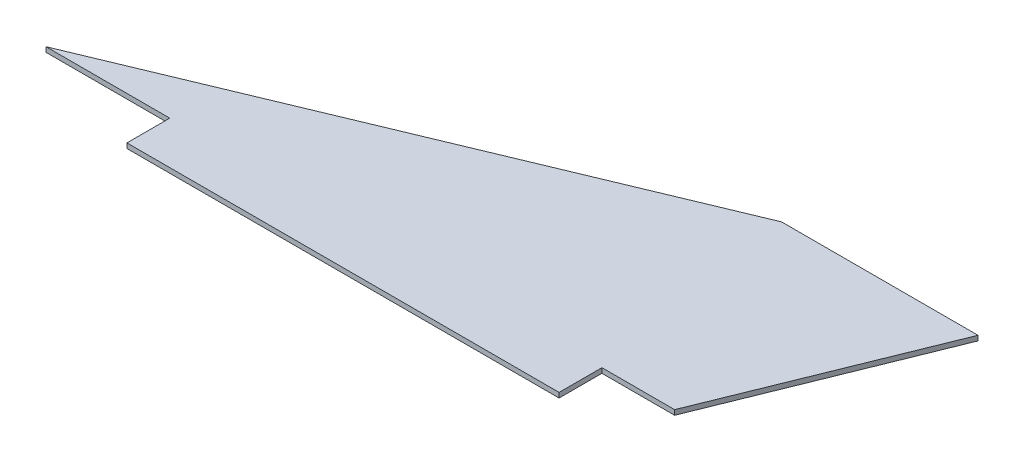
ISO-10303-21;
HEADER;
FILE_DESCRIPTION(('STEP AP214'),'2;1');
FILE_NAME('part.step','',(''),(''),'','','');
FILE_SCHEMA(('AUTOMOTIVE_DESIGN { 1 0 10303 214 1 1 1 1 }'));
ENDSEC;
DATA;
#1=APPLICATION_CONTEXT('core data for automotive mechanical design processes');
#2=APPLICATION_PROTOCOL_DEFINITION('international standard','automotive_design',2000,#1);
#3=PRODUCT_CONTEXT('',#1,'mechanical');
#4=PRODUCT('Part','Part','',(#3));
#5=PRODUCT_RELATED_PRODUCT_CATEGORY('part','',(#4));
#6=PRODUCT_DEFINITION_FORMATION('','',#4);
#7=PRODUCT_DEFINITION_CONTEXT('part definition',#1,'design');
#8=PRODUCT_DEFINITION('design','',#6,#7);
#9=PRODUCT_DEFINITION_SHAPE('','',#8);
#10=(LENGTH_UNIT() NAMED_UNIT(*) SI_UNIT(.MILLI.,.METRE.));
#11=(NAMED_UNIT(*) PLANE_ANGLE_UNIT() SI_UNIT($,.RADIAN.));
#12=(NAMED_UNIT(*) SI_UNIT($,.STERADIAN.) SOLID_ANGLE_UNIT());
#13=UNCERTAINTY_MEASURE_WITH_UNIT(LENGTH_MEASURE(1.E-05),#10,'distance_accuracy_value','');
#14=(GEOMETRIC_REPRESENTATION_CONTEXT(3) GLOBAL_UNCERTAINTY_ASSIGNED_CONTEXT((#13)) GLOBAL_UNIT_ASSIGNED_CONTEXT((#10,
#11,#12)) REPRESENTATION_CONTEXT('',''));
#15=CARTESIAN_POINT('',(0.,0.,0.));
#16=DIRECTION('',(0.,0.,1.));
#17=DIRECTION('',(1.,0.,0.));
#18=AXIS2_PLACEMENT_3D('',#15,#16,#17);
#19=CARTESIAN_POINT('',(335.842463749171,1.5875,-139.7));
#20=DIRECTION('',(0.384066320943242,0.,0.923305508007573));
#21=DIRECTION('',(0.923305508007573,0.,-0.384066320943242));
#22=AXIS2_PLACEMENT_3D('',#19,#20,#21);
#23=PLANE('',#22);
#24=DIRECTION('',(-0.923305508007573,0.,0.384066320943242));
#25=VECTOR('',#24,1.);
#26=CARTESIAN_POINT('',(335.842463749171,-1.5875,-139.7));
#27=LINE('',#26,#25);
#28=CARTESIAN_POINT('',(335.842463749171,-1.5875,-139.7));
#29=VERTEX_POINT('',#28);
#30=CARTESIAN_POINT('',(0.,-1.5875,0.));
#31=VERTEX_POINT('',#30);
#32=EDGE_CURVE('E140',#29,#31,#27,.T.);
#33=ORIENTED_EDGE('',*,*,#32,.T.);
#34=DIRECTION('',(0.,-1.,0.));
#35=VECTOR('',#34,1.);
#36=CARTESIAN_POINT('',(0.,1.5875,0.));
#37=LINE('',#36,#35);
#38=CARTESIAN_POINT('',(0.,1.5875,0.));
#39=VERTEX_POINT('',#38);
#40=EDGE_CURVE('E11',#39,#31,#37,.T.);
#41=ORIENTED_EDGE('',*,*,#40,.F.);
#42=DIRECTION('',(-0.923305508007573,0.,0.384066320943242));
#43=VECTOR('',#42,1.);
#44=CARTESIAN_POINT('',(335.842463749171,1.5875,-139.7));
#45=LINE('',#44,#43);
#46=CARTESIAN_POINT('',(335.842463749171,1.5875,-139.7));
#47=VERTEX_POINT('',#46);
#48=EDGE_CURVE('E162',#47,#39,#45,.T.);
#49=ORIENTED_EDGE('',*,*,#48,.F.);
#50=DIRECTION('',(0.,-1.,0.));
#51=VECTOR('',#50,1.);
#52=CARTESIAN_POINT('',(335.842463749171,1.5875,-139.7));
#53=LINE('',#52,#51);
#54=EDGE_CURVE('E136',#47,#29,#53,.T.);
#55=ORIENTED_EDGE('',*,*,#54,.T.);
#56=EDGE_LOOP('',(#33,#41,#49,#55));
#57=FACE_BOUND('',#56,.T.);
#58=ADVANCED_FACE('F39',(#57),#23,.F.);
#59=CARTESIAN_POINT('',(0.,1.5875,0.));
#60=DIRECTION('',(0.,0.,-1.));
#61=DIRECTION('',(-1.,0.,0.));
#62=AXIS2_PLACEMENT_3D('',#59,#60,#61);
#63=PLANE('',#62);
#64=DIRECTION('',(1.,0.,0.));
#65=VECTOR('',#64,1.);
#66=CARTESIAN_POINT('',(0.,-1.5875,0.));
#67=LINE('',#66,#65);
#68=CARTESIAN_POINT('',(80.01,-1.5875,0.));
#69=VERTEX_POINT('',#68);
#70=EDGE_CURVE('E144',#31,#69,#67,.T.);
#71=ORIENTED_EDGE('',*,*,#70,.T.);
#72=DIRECTION('',(0.,-1.,0.));
#73=VECTOR('',#72,1.);
#74=CARTESIAN_POINT('',(80.01,1.5875,0.));
#75=LINE('',#74,#73);
#76=CARTESIAN_POINT('',(80.01,1.5875,0.));
#77=VERTEX_POINT('',#76);
#78=EDGE_CURVE('E48',#77,#69,#75,.T.);
#79=ORIENTED_EDGE('',*,*,#78,.F.);
#80=DIRECTION('',(1.,0.,0.));
#81=VECTOR('',#80,1.);
#82=CARTESIAN_POINT('',(0.,1.5875,0.));
#83=LINE('',#82,#81);
#84=EDGE_CURVE('E99',#39,#77,#83,.T.);
#85=ORIENTED_EDGE('',*,*,#84,.F.);
#86=ORIENTED_EDGE('',*,*,#40,.T.);
#87=EDGE_LOOP('',(#71,#79,#85,#86));
#88=FACE_BOUND('',#87,.T.);
#89=ADVANCED_FACE('F208',(#88),#63,.F.);
#90=CARTESIAN_POINT('',(80.01,1.5875,0.));
#91=DIRECTION('',(1.,0.,0.));
#92=DIRECTION('',(0.,0.,-1.));
#93=AXIS2_PLACEMENT_3D('',#90,#91,#92);
#94=PLANE('',#93);
#95=DIRECTION('',(0.,0.,1.));
#96=VECTOR('',#95,1.);
#97=CARTESIAN_POINT('',(80.01,-1.5875,0.));
#98=LINE('',#97,#96);
#99=CARTESIAN_POINT('',(80.01,-1.5875,27.686));
#100=VERTEX_POINT('',#99);
#101=EDGE_CURVE('E147',#69,#100,#98,.T.);
#102=ORIENTED_EDGE('',*,*,#101,.T.);
#103=DIRECTION('',(0.,-1.,0.));
#104=VECTOR('',#103,1.);
#105=CARTESIAN_POINT('',(80.01,1.5875,27.686));
#106=LINE('',#105,#104);
#107=CARTESIAN_POINT('',(80.01,1.5875,27.686));
#108=VERTEX_POINT('',#107);
#109=EDGE_CURVE('E173',#108,#100,#106,.T.);
#110=ORIENTED_EDGE('',*,*,#109,.F.);
#111=DIRECTION('',(0.,0.,1.));
#112=VECTOR('',#111,1.);
#113=CARTESIAN_POINT('',(80.01,1.5875,0.));
#114=LINE('',#113,#112);
#115=EDGE_CURVE('E183',#77,#108,#114,.T.);
#116=ORIENTED_EDGE('',*,*,#115,.F.);
#117=ORIENTED_EDGE('',*,*,#78,.T.);
#118=EDGE_LOOP('',(#102,#110,#116,#117));
#119=FACE_BOUND('',#118,.T.);
#120=ADVANCED_FACE('F181',(#119),#94,.F.);
#121=CARTESIAN_POINT('',(80.01,1.5875,27.686));
#122=DIRECTION('',(0.,0.,-1.));
#123=DIRECTION('',(-1.,0.,0.));
#124=AXIS2_PLACEMENT_3D('',#121,#122,#123);
#125=PLANE('',#124);
#126=DIRECTION('',(1.,0.,0.));
#127=VECTOR('',#126,1.);
#128=CARTESIAN_POINT('',(80.01,-1.5875,27.686));
#129=LINE('',#128,#127);
#130=CARTESIAN_POINT('',(359.41,-1.5875,27.686));
#131=VERTEX_POINT('',#130);
#132=EDGE_CURVE('E150',#100,#131,#129,.T.);
#133=ORIENTED_EDGE('',*,*,#132,.T.);
#134=DIRECTION('',(0.,-1.,0.));
#135=VECTOR('',#134,1.);
#136=CARTESIAN_POINT('',(359.41,1.5875,27.686));
#137=LINE('',#136,#135);
#138=CARTESIAN_POINT('',(359.41,1.5875,27.686));
#139=VERTEX_POINT('',#138);
#140=EDGE_CURVE('E169',#139,#131,#137,.T.);
#141=ORIENTED_EDGE('',*,*,#140,.F.);
#142=DIRECTION('',(1.,0.,0.));
#143=VECTOR('',#142,1.);
#144=CARTESIAN_POINT('',(80.01,1.5875,27.686));
#145=LINE('',#144,#143);
#146=EDGE_CURVE('E196',#108,#139,#145,.T.);
#147=ORIENTED_EDGE('',*,*,#146,.F.);
#148=ORIENTED_EDGE('',*,*,#109,.T.);
#149=EDGE_LOOP('',(#133,#141,#147,#148));
#150=FACE_BOUND('',#149,.T.);
#151=ADVANCED_FACE('F191',(#150),#125,.F.);
#152=CARTESIAN_POINT('',(359.41,1.5875,27.686));
#153=DIRECTION('',(-1.,0.,0.));
#154=DIRECTION('',(0.,0.,1.));
#155=AXIS2_PLACEMENT_3D('',#152,#153,#154);
#156=PLANE('',#155);
#157=DIRECTION('',(0.,0.,-1.));
#158=VECTOR('',#157,1.);
#159=CARTESIAN_POINT('',(359.41,-1.5875,27.686));
#160=LINE('',#159,#158);
#161=CARTESIAN_POINT('',(359.41,-1.5875,0.));
#162=VERTEX_POINT('',#161);
#163=EDGE_CURVE('E153',#131,#162,#160,.T.);
#164=ORIENTED_EDGE('',*,*,#163,.T.);
#165=DIRECTION('',(0.,-1.,0.));
#166=VECTOR('',#165,1.);
#167=CARTESIAN_POINT('',(359.41,1.5875,0.));
#168=LINE('',#167,#166);
#169=CARTESIAN_POINT('',(359.41,1.5875,0.));
#170=VERTEX_POINT('',#169);
#171=EDGE_CURVE('E129',#170,#162,#168,.T.);
#172=ORIENTED_EDGE('',*,*,#171,.F.);
#173=DIRECTION('',(0.,0.,-1.));
#174=VECTOR('',#173,1.);
#175=CARTESIAN_POINT('',(359.41,1.5875,27.686));
#176=LINE('',#175,#174);
#177=EDGE_CURVE('E118',#139,#170,#176,.T.);
#178=ORIENTED_EDGE('',*,*,#177,.F.);
#179=ORIENTED_EDGE('',*,*,#140,.T.);
#180=EDGE_LOOP('',(#164,#172,#178,#179));
#181=FACE_BOUND('',#180,.T.);
#182=ADVANCED_FACE('F194',(#181),#156,.F.);
#183=CARTESIAN_POINT('',(359.41,1.5875,0.));
#184=DIRECTION('',(0.,0.,-1.));
#185=DIRECTION('',(-1.,0.,0.));
#186=AXIS2_PLACEMENT_3D('',#183,#184,#185);
#187=PLANE('',#186);
#188=DIRECTION('',(1.,0.,0.));
#189=VECTOR('',#188,1.);
#190=CARTESIAN_POINT('',(359.41,-1.5875,0.));
#191=LINE('',#190,#189);
#192=CARTESIAN_POINT('',(406.4,-1.5875,0.));
#193=VERTEX_POINT('',#192);
#194=EDGE_CURVE('E127',#162,#193,#191,.T.);
#195=ORIENTED_EDGE('',*,*,#194,.T.);
#196=DIRECTION('',(0.,-1.,0.));
#197=VECTOR('',#196,1.);
#198=CARTESIAN_POINT('',(406.4,1.5875,0.));
#199=LINE('',#198,#197);
#200=CARTESIAN_POINT('',(406.4,1.5875,0.));
#201=VERTEX_POINT('',#200);
#202=EDGE_CURVE('E124',#201,#193,#199,.T.);
#203=ORIENTED_EDGE('',*,*,#202,.F.);
#204=DIRECTION('',(1.,0.,0.));
#205=VECTOR('',#204,1.);
#206=CARTESIAN_POINT('',(359.41,1.5875,0.));
#207=LINE('',#206,#205);
#208=EDGE_CURVE('E112',#170,#201,#207,.T.);
#209=ORIENTED_EDGE('',*,*,#208,.F.);
#210=ORIENTED_EDGE('',*,*,#171,.T.);
#211=EDGE_LOOP('',(#195,#203,#209,#210));
#212=FACE_BOUND('',#211,.T.);
#213=ADVANCED_FACE('F125',(#212),#187,.F.);
#214=CARTESIAN_POINT('',(406.4,1.5875,0.));
#215=DIRECTION('',(-0.927183854566789,0.,-0.374606593415909));
#216=DIRECTION('',(-0.374606593415909,0.,0.927183854566789));
#217=AXIS2_PLACEMENT_3D('',#214,#215,#216);
#218=PLANE('',#217);
#219=DIRECTION('',(0.374606593415909,0.,-0.927183854566789));
#220=VECTOR('',#219,1.);
#221=CARTESIAN_POINT('',(406.4,-1.5875,0.));
#222=LINE('',#221,#220);
#223=CARTESIAN_POINT('',(462.842463749171,-1.5875,-139.7));
#224=VERTEX_POINT('',#223);
#225=EDGE_CURVE('E85',#193,#224,#222,.T.);
#226=ORIENTED_EDGE('',*,*,#225,.T.);
#227=DIRECTION('',(0.,-1.,0.));
#228=VECTOR('',#227,1.);
#229=CARTESIAN_POINT('',(462.842463749171,1.5875,-139.7));
#230=LINE('',#229,#228);
#231=CARTESIAN_POINT('',(462.842463749171,1.5875,-139.7));
#232=VERTEX_POINT('',#231);
#233=EDGE_CURVE('E130',#232,#224,#230,.T.);
#234=ORIENTED_EDGE('',*,*,#233,.F.);
#235=DIRECTION('',(0.374606593415909,0.,-0.927183854566789));
#236=VECTOR('',#235,1.);
#237=CARTESIAN_POINT('',(406.4,1.5875,0.));
#238=LINE('',#237,#236);
#239=EDGE_CURVE('E116',#201,#232,#238,.T.);
#240=ORIENTED_EDGE('',*,*,#239,.F.);
#241=ORIENTED_EDGE('',*,*,#202,.T.);
#242=EDGE_LOOP('',(#226,#234,#240,#241));
#243=FACE_BOUND('',#242,.T.);
#244=ADVANCED_FACE('F132',(#243),#218,.F.);
#245=CARTESIAN_POINT('',(462.842463749171,1.5875,-139.7));
#246=DIRECTION('',(0.,0.,1.));
#247=DIRECTION('',(1.,0.,0.));
#248=AXIS2_PLACEMENT_3D('',#245,#246,#247);
#249=PLANE('',#248);
#250=DIRECTION('',(-1.,0.,0.));
#251=VECTOR('',#250,1.);
#252=CARTESIAN_POINT('',(462.842463749171,-1.5875,-139.7));
#253=LINE('',#252,#251);
#254=EDGE_CURVE('E91',#224,#29,#253,.T.);
#255=ORIENTED_EDGE('',*,*,#254,.T.);
#256=ORIENTED_EDGE('',*,*,#54,.F.);
#257=DIRECTION('',(-1.,0.,0.));
#258=VECTOR('',#257,1.);
#259=CARTESIAN_POINT('',(462.842463749171,1.5875,-139.7));
#260=LINE('',#259,#258);
#261=EDGE_CURVE('E56',#232,#47,#260,.T.);
#262=ORIENTED_EDGE('',*,*,#261,.F.);
#263=ORIENTED_EDGE('',*,*,#233,.T.);
#264=EDGE_LOOP('',(#255,#256,#262,#263));
#265=FACE_BOUND('',#264,.T.);
#266=ADVANCED_FACE('F224',(#265),#249,.F.);
#267=CARTESIAN_POINT('',(0.,1.5875,0.));
#268=DIRECTION('',(0.,1.,0.));
#269=DIRECTION('',(0.,0.,1.));
#270=AXIS2_PLACEMENT_3D('',#267,#268,#269);
#271=PLANE('',#270);
#272=ORIENTED_EDGE('',*,*,#48,.T.);
#273=ORIENTED_EDGE('',*,*,#84,.T.);
#274=ORIENTED_EDGE('',*,*,#115,.T.);
#275=ORIENTED_EDGE('',*,*,#146,.T.);
#276=ORIENTED_EDGE('',*,*,#177,.T.);
#277=ORIENTED_EDGE('',*,*,#208,.T.);
#278=ORIENTED_EDGE('',*,*,#239,.T.);
#279=ORIENTED_EDGE('',*,*,#261,.T.);
#280=EDGE_LOOP('',(#272,#273,#274,#275,#276,#277,#278,#279));
#281=FACE_BOUND('',#280,.T.);
#282=ADVANCED_FACE('F114',(#281),#271,.T.);
#283=CARTESIAN_POINT('',(0.,-1.5875,0.));
#284=DIRECTION('',(0.,1.,0.));
#285=DIRECTION('',(0.,0.,1.));
#286=AXIS2_PLACEMENT_3D('',#283,#284,#285);
#287=PLANE('',#286);
#288=ORIENTED_EDGE('',*,*,#32,.F.);
#289=ORIENTED_EDGE('',*,*,#254,.F.);
#290=ORIENTED_EDGE('',*,*,#225,.F.);
#291=ORIENTED_EDGE('',*,*,#194,.F.);
#292=ORIENTED_EDGE('',*,*,#163,.F.);
#293=ORIENTED_EDGE('',*,*,#132,.F.);
#294=ORIENTED_EDGE('',*,*,#101,.F.);
#295=ORIENTED_EDGE('',*,*,#70,.F.);
#296=EDGE_LOOP('',(#288,#289,#290,#291,#292,#293,#294,#295));
#297=FACE_BOUND('',#296,.T.);
#298=ADVANCED_FACE('F187',(#297),#287,.F.);
#299=CLOSED_SHELL('',(#58,#89,#120,#151,#182,#213,#244,#266,#282,#298));
#300=MANIFOLD_SOLID_BREP('B2',#299);
#301=ADVANCED_BREP_SHAPE_REPRESENTATION('',(#18,#300),#14);
#302=SHAPE_DEFINITION_REPRESENTATION(#9,#301);
ENDSEC;
END-ISO-10303-21;
